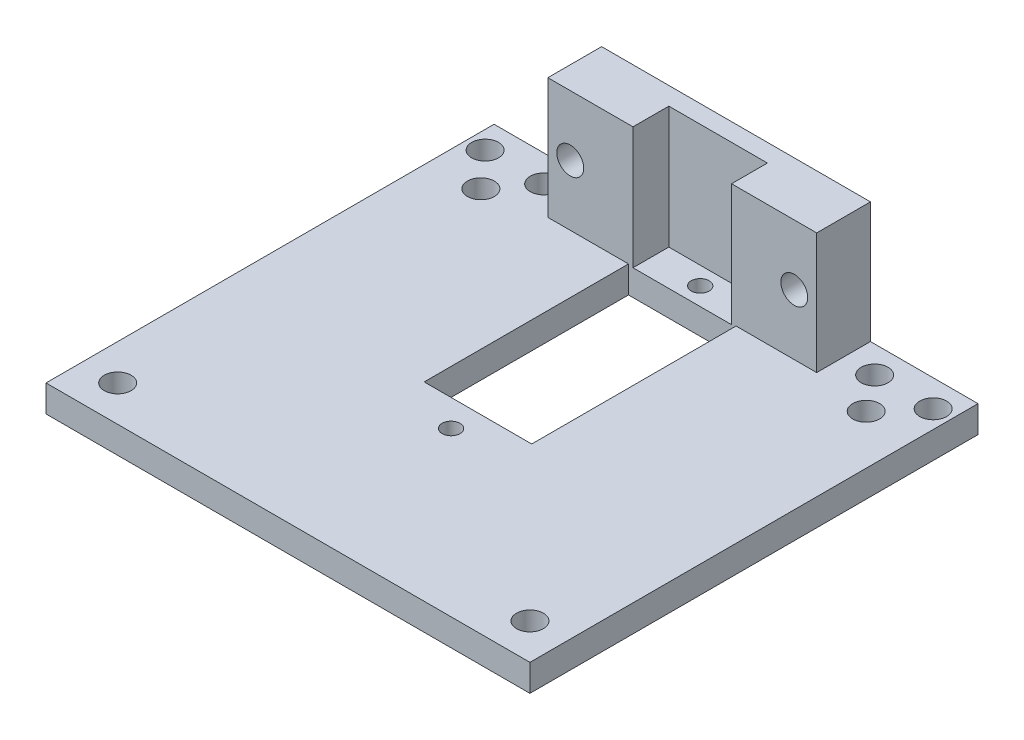
ISO-10303-21;
HEADER;
FILE_DESCRIPTION(('STEP AP214'),'2;1');
FILE_NAME('part.step','',(''),(''),'','','');
FILE_SCHEMA(('AUTOMOTIVE_DESIGN { 1 0 10303 214 1 1 1 1 }'));
ENDSEC;
DATA;
#1=APPLICATION_CONTEXT('core data for automotive mechanical design processes');
#2=APPLICATION_PROTOCOL_DEFINITION('international standard','automotive_design',2000,#1);
#3=PRODUCT_CONTEXT('',#1,'mechanical');
#4=PRODUCT('Part','Part','',(#3));
#5=PRODUCT_RELATED_PRODUCT_CATEGORY('part','',(#4));
#6=PRODUCT_DEFINITION_FORMATION('','',#4);
#7=PRODUCT_DEFINITION_CONTEXT('part definition',#1,'design');
#8=PRODUCT_DEFINITION('design','',#6,#7);
#9=PRODUCT_DEFINITION_SHAPE('','',#8);
#10=(LENGTH_UNIT() NAMED_UNIT(*) SI_UNIT(.MILLI.,.METRE.));
#11=(NAMED_UNIT(*) PLANE_ANGLE_UNIT() SI_UNIT($,.RADIAN.));
#12=(NAMED_UNIT(*) SI_UNIT($,.STERADIAN.) SOLID_ANGLE_UNIT());
#13=UNCERTAINTY_MEASURE_WITH_UNIT(LENGTH_MEASURE(1.E-05),#10,'distance_accuracy_value','');
#14=(GEOMETRIC_REPRESENTATION_CONTEXT(3) GLOBAL_UNCERTAINTY_ASSIGNED_CONTEXT((#13)) GLOBAL_UNIT_ASSIGNED_CONTEXT((#10,
#11,#12)) REPRESENTATION_CONTEXT('',''));
#15=CARTESIAN_POINT('',(0.,0.,0.));
#16=DIRECTION('',(0.,0.,1.));
#17=DIRECTION('',(1.,0.,0.));
#18=AXIS2_PLACEMENT_3D('',#15,#16,#17);
#19=CARTESIAN_POINT('',(0.,0.,0.));
#20=DIRECTION('',(0.,0.,-1.));
#21=DIRECTION('',(-1.,0.,0.));
#22=AXIS2_PLACEMENT_3D('',#19,#20,#21);
#23=PLANE('',#22);
#24=CARTESIAN_POINT('',(10.5,26.75,0.));
#25=DIRECTION('',(0.,0.,1.));
#26=DIRECTION('',(1.,0.,0.));
#27=AXIS2_PLACEMENT_3D('',#24,#25,#26);
#28=CIRCLE('',#27,1.5);
#29=CARTESIAN_POINT('',(12.,26.75,0.));
#30=VERTEX_POINT('',#29);
#31=EDGE_CURVE('E337',#30,#30,#28,.T.);
#32=ORIENTED_EDGE('',*,*,#31,.T.);
#33=EDGE_LOOP('',(#32));
#34=FACE_BOUND('',#33,.T.);
#35=CARTESIAN_POINT('',(35.5,26.75,0.));
#36=DIRECTION('',(0.,0.,1.));
#37=DIRECTION('',(-1.,0.,0.));
#38=AXIS2_PLACEMENT_3D('',#35,#36,#37);
#39=CIRCLE('',#38,1.49999999999999);
#40=CARTESIAN_POINT('',(34.,26.75,0.));
#41=VERTEX_POINT('',#40);
#42=EDGE_CURVE('E333',#41,#41,#39,.T.);
#43=ORIENTED_EDGE('',*,*,#42,.T.);
#44=EDGE_LOOP('',(#43));
#45=FACE_BOUND('',#44,.T.);
#46=DIRECTION('',(0.,1.,0.));
#47=VECTOR('',#46,1.);
#48=CARTESIAN_POINT('',(50.,20.,0.));
#49=LINE('',#48,#47);
#50=CARTESIAN_POINT('',(50.,17.,0.));
#51=VERTEX_POINT('',#50);
#52=CARTESIAN_POINT('',(50.,20.,0.));
#53=VERTEX_POINT('',#52);
#54=EDGE_CURVE('E164',#51,#53,#49,.T.);
#55=ORIENTED_EDGE('',*,*,#54,.F.);
#56=DIRECTION('',(1.,0.,0.));
#57=VECTOR('',#56,1.);
#58=CARTESIAN_POINT('',(46.,17.,0.));
#59=LINE('',#58,#57);
#60=CARTESIAN_POINT('',(-4.,17.,0.));
#61=VERTEX_POINT('',#60);
#62=EDGE_CURVE('E60',#61,#51,#59,.T.);
#63=ORIENTED_EDGE('',*,*,#62,.F.);
#64=DIRECTION('',(0.,-1.,0.));
#65=VECTOR('',#64,1.);
#66=CARTESIAN_POINT('',(-4.,0.,0.));
#67=LINE('',#66,#65);
#68=CARTESIAN_POINT('',(-4.00000000000001,20.,0.));
#69=VERTEX_POINT('',#68);
#70=EDGE_CURVE('E162',#69,#61,#67,.T.);
#71=ORIENTED_EDGE('',*,*,#70,.F.);
#72=DIRECTION('',(-1.,0.,0.));
#73=VECTOR('',#72,1.);
#74=CARTESIAN_POINT('',(-4.00000000000001,20.,0.));
#75=LINE('',#74,#73);
#76=CARTESIAN_POINT('',(8.,20.,0.));
#77=VERTEX_POINT('',#76);
#78=EDGE_CURVE('E182',#77,#69,#75,.T.);
#79=ORIENTED_EDGE('',*,*,#78,.F.);
#80=DIRECTION('',(0.,-1.,0.));
#81=VECTOR('',#80,1.);
#82=CARTESIAN_POINT('',(8.,20.,0.));
#83=LINE('',#82,#81);
#84=CARTESIAN_POINT('',(8.,33.5,0.));
#85=VERTEX_POINT('',#84);
#86=EDGE_CURVE('E186',#85,#77,#83,.T.);
#87=ORIENTED_EDGE('',*,*,#86,.F.);
#88=DIRECTION('',(-1.,0.,0.));
#89=VECTOR('',#88,1.);
#90=CARTESIAN_POINT('',(8.,33.5,0.));
#91=LINE('',#90,#89);
#92=CARTESIAN_POINT('',(38.,33.5,0.));
#93=VERTEX_POINT('',#92);
#94=EDGE_CURVE('E354',#93,#85,#91,.T.);
#95=ORIENTED_EDGE('',*,*,#94,.F.);
#96=DIRECTION('',(0.,1.,0.));
#97=VECTOR('',#96,1.);
#98=CARTESIAN_POINT('',(38.,33.5,0.));
#99=LINE('',#98,#97);
#100=CARTESIAN_POINT('',(38.,20.,0.));
#101=VERTEX_POINT('',#100);
#102=EDGE_CURVE('E352',#101,#93,#99,.T.);
#103=ORIENTED_EDGE('',*,*,#102,.F.);
#104=DIRECTION('',(-1.,0.,0.));
#105=VECTOR('',#104,1.);
#106=CARTESIAN_POINT('',(38.,20.,0.));
#107=LINE('',#106,#105);
#108=EDGE_CURVE('E350',#53,#101,#107,.T.);
#109=ORIENTED_EDGE('',*,*,#108,.F.);
#110=EDGE_LOOP('',(#55,#63,#71,#79,#87,#95,#103,#109));
#111=FACE_BOUND('',#110,.T.);
#112=ADVANCED_FACE('F43',(#34,#45,#111),#23,.T.);
#113=CARTESIAN_POINT('',(50.,20.,6.));
#114=DIRECTION('',(-1.,0.,0.));
#115=DIRECTION('',(0.,-1.,0.));
#116=AXIS2_PLACEMENT_3D('',#113,#114,#115);
#117=PLANE('',#116);
#118=DIRECTION('',(0.,0.,-1.));
#119=VECTOR('',#118,1.);
#120=CARTESIAN_POINT('',(50.,17.,50.));
#121=LINE('',#120,#119);
#122=CARTESIAN_POINT('',(50.,17.,50.));
#123=VERTEX_POINT('',#122);
#124=EDGE_CURVE('E175',#123,#51,#121,.T.);
#125=ORIENTED_EDGE('',*,*,#124,.T.);
#126=ORIENTED_EDGE('',*,*,#54,.T.);
#127=DIRECTION('',(0.,0.,-1.));
#128=VECTOR('',#127,1.);
#129=CARTESIAN_POINT('',(50.,20.,6.));
#130=LINE('',#129,#128);
#131=CARTESIAN_POINT('',(50.,20.,50.));
#132=VERTEX_POINT('',#131);
#133=EDGE_CURVE('E12',#132,#53,#130,.T.);
#134=ORIENTED_EDGE('',*,*,#133,.F.);
#135=DIRECTION('',(0.,1.,0.));
#136=VECTOR('',#135,1.);
#137=CARTESIAN_POINT('',(50.,20.,50.));
#138=LINE('',#137,#136);
#139=EDGE_CURVE('E321',#123,#132,#138,.T.);
#140=ORIENTED_EDGE('',*,*,#139,.F.);
#141=EDGE_LOOP('',(#125,#126,#134,#140));
#142=FACE_BOUND('',#141,.T.);
#143=ADVANCED_FACE('F385',(#142),#117,.F.);
#144=CARTESIAN_POINT('',(-4.,0.,6.));
#145=DIRECTION('',(1.,0.,0.));
#146=DIRECTION('',(0.,1.,0.));
#147=AXIS2_PLACEMENT_3D('',#144,#145,#146);
#148=PLANE('',#147);
#149=ORIENTED_EDGE('',*,*,#70,.T.);
#150=DIRECTION('',(0.,0.,-1.));
#151=VECTOR('',#150,1.);
#152=CARTESIAN_POINT('',(-4.,17.,50.));
#153=LINE('',#152,#151);
#154=CARTESIAN_POINT('',(-4.,17.,50.));
#155=VERTEX_POINT('',#154);
#156=EDGE_CURVE('E169',#155,#61,#153,.T.);
#157=ORIENTED_EDGE('',*,*,#156,.F.);
#158=DIRECTION('',(0.,-1.,0.));
#159=VECTOR('',#158,1.);
#160=CARTESIAN_POINT('',(-4.,17.,50.));
#161=LINE('',#160,#159);
#162=CARTESIAN_POINT('',(-4.00000000000001,20.,50.));
#163=VERTEX_POINT('',#162);
#164=EDGE_CURVE('E176',#163,#155,#161,.T.);
#165=ORIENTED_EDGE('',*,*,#164,.F.);
#166=DIRECTION('',(0.,0.,-1.));
#167=VECTOR('',#166,1.);
#168=CARTESIAN_POINT('',(-4.00000000000001,20.,6.));
#169=LINE('',#168,#167);
#170=EDGE_CURVE('E180',#163,#69,#169,.T.);
#171=ORIENTED_EDGE('',*,*,#170,.T.);
#172=EDGE_LOOP('',(#149,#157,#165,#171));
#173=FACE_BOUND('',#172,.T.);
#174=ADVANCED_FACE('F179',(#173),#148,.F.);
#175=CARTESIAN_POINT('',(0.,0.,6.));
#176=DIRECTION('',(0.,0.,-1.));
#177=DIRECTION('',(-1.,0.,0.));
#178=AXIS2_PLACEMENT_3D('',#175,#176,#177);
#179=PLANE('',#178);
#180=CARTESIAN_POINT('',(35.5,26.75,6.));
#181=DIRECTION('',(0.,0.,1.));
#182=DIRECTION('',(-1.,0.,0.));
#183=AXIS2_PLACEMENT_3D('',#180,#181,#182);
#184=CIRCLE('',#183,1.49999999999999);
#185=CARTESIAN_POINT('',(34.,26.75,6.));
#186=VERTEX_POINT('',#185);
#187=EDGE_CURVE('E334',#186,#186,#184,.T.);
#188=ORIENTED_EDGE('',*,*,#187,.F.);
#189=EDGE_LOOP('',(#188));
#190=FACE_BOUND('',#189,.T.);
#191=CARTESIAN_POINT('',(10.5,26.75,6.));
#192=DIRECTION('',(0.,0.,1.));
#193=DIRECTION('',(1.,0.,0.));
#194=AXIS2_PLACEMENT_3D('',#191,#192,#193);
#195=CIRCLE('',#194,1.5);
#196=CARTESIAN_POINT('',(12.,26.75,6.));
#197=VERTEX_POINT('',#196);
#198=EDGE_CURVE('E165',#197,#197,#195,.T.);
#199=ORIENTED_EDGE('',*,*,#198,.F.);
#200=EDGE_LOOP('',(#199));
#201=FACE_BOUND('',#200,.T.);
#202=DIRECTION('',(1.,0.,0.));
#203=VECTOR('',#202,1.);
#204=CARTESIAN_POINT('',(17.5,19.88,6.));
#205=LINE('',#204,#203);
#206=CARTESIAN_POINT('',(17.5,19.88,6.));
#207=VERTEX_POINT('',#206);
#208=CARTESIAN_POINT('',(28.5,19.88,6.));
#209=VERTEX_POINT('',#208);
#210=EDGE_CURVE('E235',#207,#209,#205,.T.);
#211=ORIENTED_EDGE('',*,*,#210,.F.);
#212=DIRECTION('',(0.,1.,0.));
#213=VECTOR('',#212,1.);
#214=CARTESIAN_POINT('',(17.5,19.88,6.));
#215=LINE('',#214,#213);
#216=CARTESIAN_POINT('',(17.5,33.5,6.));
#217=VERTEX_POINT('',#216);
#218=EDGE_CURVE('E253',#207,#217,#215,.T.);
#219=ORIENTED_EDGE('',*,*,#218,.T.);
#220=DIRECTION('',(-1.,0.,0.));
#221=VECTOR('',#220,1.);
#222=CARTESIAN_POINT('',(8.,33.5,6.));
#223=LINE('',#222,#221);
#224=CARTESIAN_POINT('',(8.,33.5,6.));
#225=VERTEX_POINT('',#224);
#226=EDGE_CURVE('E184',#217,#225,#223,.T.);
#227=ORIENTED_EDGE('',*,*,#226,.T.);
#228=DIRECTION('',(0.,-1.,0.));
#229=VECTOR('',#228,1.);
#230=CARTESIAN_POINT('',(8.,20.,6.));
#231=LINE('',#230,#229);
#232=CARTESIAN_POINT('',(8.,20.,6.));
#233=VERTEX_POINT('',#232);
#234=EDGE_CURVE('E192',#225,#233,#231,.T.);
#235=ORIENTED_EDGE('',*,*,#234,.T.);
#236=DIRECTION('',(-1.,0.,0.));
#237=VECTOR('',#236,1.);
#238=CARTESIAN_POINT('',(0.,20.,6.));
#239=LINE('',#238,#237);
#240=CARTESIAN_POINT('',(17.,20.,6.));
#241=VERTEX_POINT('',#240);
#242=EDGE_CURVE('E329',#241,#233,#239,.T.);
#243=ORIENTED_EDGE('',*,*,#242,.F.);
#244=DIRECTION('',(0.,1.,0.));
#245=VECTOR('',#244,1.);
#246=CARTESIAN_POINT('',(17.,-3.99999999999998,5.99999999999999));
#247=LINE('',#246,#245);
#248=CARTESIAN_POINT('',(17.,17.,5.99999999999999));
#249=VERTEX_POINT('',#248);
#250=EDGE_CURVE('E276',#249,#241,#247,.T.);
#251=ORIENTED_EDGE('',*,*,#250,.F.);
#252=DIRECTION('',(-1.,0.,0.));
#253=VECTOR('',#252,1.);
#254=CARTESIAN_POINT('',(46.,17.,6.));
#255=LINE('',#254,#253);
#256=CARTESIAN_POINT('',(29.,17.,5.99999999999999));
#257=VERTEX_POINT('',#256);
#258=EDGE_CURVE('E305',#257,#249,#255,.T.);
#259=ORIENTED_EDGE('',*,*,#258,.F.);
#260=DIRECTION('',(0.,1.,0.));
#261=VECTOR('',#260,1.);
#262=CARTESIAN_POINT('',(29.,-3.99999999999998,5.99999999999999));
#263=LINE('',#262,#261);
#264=CARTESIAN_POINT('',(29.,20.,5.99999999999999));
#265=VERTEX_POINT('',#264);
#266=EDGE_CURVE('E266',#257,#265,#263,.T.);
#267=ORIENTED_EDGE('',*,*,#266,.T.);
#268=CARTESIAN_POINT('',(38.,20.,6.));
#269=VERTEX_POINT('',#268);
#270=EDGE_CURVE('E330',#269,#265,#239,.T.);
#271=ORIENTED_EDGE('',*,*,#270,.F.);
#272=DIRECTION('',(0.,1.,0.));
#273=VECTOR('',#272,1.);
#274=CARTESIAN_POINT('',(38.,33.5,6.));
#275=LINE('',#274,#273);
#276=CARTESIAN_POINT('',(38.,33.5,6.));
#277=VERTEX_POINT('',#276);
#278=EDGE_CURVE('E181',#269,#277,#275,.T.);
#279=ORIENTED_EDGE('',*,*,#278,.T.);
#280=CARTESIAN_POINT('',(28.5,33.5,6.));
#281=VERTEX_POINT('',#280);
#282=EDGE_CURVE('E344',#277,#281,#223,.T.);
#283=ORIENTED_EDGE('',*,*,#282,.T.);
#284=DIRECTION('',(0.,1.,0.));
#285=VECTOR('',#284,1.);
#286=CARTESIAN_POINT('',(28.5,19.88,6.));
#287=LINE('',#286,#285);
#288=EDGE_CURVE('E68',#209,#281,#287,.T.);
#289=ORIENTED_EDGE('',*,*,#288,.F.);
#290=EDGE_LOOP('',(#211,#219,#227,#235,#243,#251,#259,#267,#271,#279,#283,#289));
#291=FACE_BOUND('',#290,.T.);
#292=ADVANCED_FACE('F370',(#190,#201,#291),#179,.F.);
#293=CARTESIAN_POINT('',(46.,17.,6.));
#294=DIRECTION('',(0.,1.,0.));
#295=DIRECTION('',(-1.,0.,0.));
#296=AXIS2_PLACEMENT_3D('',#293,#294,#295);
#297=PLANE('',#296);
#298=ORIENTED_EDGE('',*,*,#62,.T.);
#299=ORIENTED_EDGE('',*,*,#124,.F.);
#300=DIRECTION('',(1.,0.,0.));
#301=VECTOR('',#300,1.);
#302=CARTESIAN_POINT('',(50.,17.,50.));
#303=LINE('',#302,#301);
#304=EDGE_CURVE('E172',#155,#123,#303,.T.);
#305=ORIENTED_EDGE('',*,*,#304,.F.);
#306=ORIENTED_EDGE('',*,*,#156,.T.);
#307=EDGE_LOOP('',(#298,#299,#305,#306));
#308=FACE_BOUND('',#307,.T.);
#309=CARTESIAN_POINT('',(0.,17.,46.));
#310=DIRECTION('',(0.,1.,0.));
#311=DIRECTION('',(-1.,0.,0.));
#312=AXIS2_PLACEMENT_3D('',#309,#310,#311);
#313=CIRCLE('',#312,1.5);
#314=CARTESIAN_POINT('',(0.,17.,47.5));
#315=VERTEX_POINT('',#314);
#316=EDGE_CURVE('E225',#315,#315,#313,.T.);
#317=ORIENTED_EDGE('',*,*,#316,.T.);
#318=EDGE_LOOP('',(#317));
#319=FACE_BOUND('',#318,.T.);
#320=CARTESIAN_POINT('',(46.,17.,46.));
#321=DIRECTION('',(0.,1.,0.));
#322=DIRECTION('',(-1.,0.,0.));
#323=AXIS2_PLACEMENT_3D('',#320,#321,#322);
#324=CIRCLE('',#323,1.5);
#325=CARTESIAN_POINT('',(46.,17.,47.5));
#326=VERTEX_POINT('',#325);
#327=EDGE_CURVE('E220',#326,#326,#324,.T.);
#328=ORIENTED_EDGE('',*,*,#327,.T.);
#329=EDGE_LOOP('',(#328));
#330=FACE_BOUND('',#329,.T.);
#331=CARTESIAN_POINT('',(23.,17.,4.));
#332=DIRECTION('',(0.,1.,0.));
#333=DIRECTION('',(-1.,0.,0.));
#334=AXIS2_PLACEMENT_3D('',#331,#332,#333);
#335=CIRCLE('',#334,1.);
#336=CARTESIAN_POINT('',(22.,17.,4.));
#337=VERTEX_POINT('',#336);
#338=EDGE_CURVE('E231',#337,#337,#335,.T.);
#339=ORIENTED_EDGE('',*,*,#338,.T.);
#340=EDGE_LOOP('',(#339));
#341=FACE_BOUND('',#340,.T.);
#342=CARTESIAN_POINT('',(23.,17.,31.8));
#343=DIRECTION('',(0.,1.,0.));
#344=DIRECTION('',(-1.,0.,0.));
#345=AXIS2_PLACEMENT_3D('',#342,#343,#344);
#346=CIRCLE('',#345,1.);
#347=CARTESIAN_POINT('',(22.,17.,31.8));
#348=VERTEX_POINT('',#347);
#349=EDGE_CURVE('E317',#348,#348,#346,.T.);
#350=ORIENTED_EDGE('',*,*,#349,.T.);
#351=EDGE_LOOP('',(#350));
#352=FACE_BOUND('',#351,.T.);
#353=CARTESIAN_POINT('',(1.49999999999999,17.,6.97423575837485));
#354=DIRECTION('',(0.,1.,0.));
#355=DIRECTION('',(-1.,0.,0.));
#356=AXIS2_PLACEMENT_3D('',#353,#354,#355);
#357=CIRCLE('',#356,1.5);
#358=CARTESIAN_POINT('',(0.,17.,6.97423575837485));
#359=VERTEX_POINT('',#358);
#360=EDGE_CURVE('E314',#359,#359,#357,.T.);
#361=ORIENTED_EDGE('',*,*,#360,.T.);
#362=EDGE_LOOP('',(#361));
#363=FACE_BOUND('',#362,.T.);
#364=CARTESIAN_POINT('',(41.4659515269438,17.,3.));
#365=DIRECTION('',(0.,1.,0.));
#366=DIRECTION('',(-1.,0.,0.));
#367=AXIS2_PLACEMENT_3D('',#364,#365,#366);
#368=CIRCLE('',#367,1.5);
#369=CARTESIAN_POINT('',(39.9659515269438,17.,3.));
#370=VERTEX_POINT('',#369);
#371=EDGE_CURVE('E311',#370,#370,#368,.T.);
#372=ORIENTED_EDGE('',*,*,#371,.T.);
#373=EDGE_LOOP('',(#372));
#374=FACE_BOUND('',#373,.T.);
#375=CARTESIAN_POINT('',(44.5,17.,6.97423575837485));
#376=DIRECTION('',(0.,1.,0.));
#377=DIRECTION('',(-1.,0.,0.));
#378=AXIS2_PLACEMENT_3D('',#375,#376,#377);
#379=CIRCLE('',#378,1.5);
#380=CARTESIAN_POINT('',(43.,17.,6.97423575837485));
#381=VERTEX_POINT('',#380);
#382=EDGE_CURVE('E308',#381,#381,#379,.T.);
#383=ORIENTED_EDGE('',*,*,#382,.T.);
#384=EDGE_LOOP('',(#383));
#385=FACE_BOUND('',#384,.T.);
#386=DIRECTION('',(0.,0.,-1.));
#387=VECTOR('',#386,1.);
#388=CARTESIAN_POINT('',(29.,17.,5.99999999999999));
#389=LINE('',#388,#387);
#390=CARTESIAN_POINT('',(29.,17.,28.8));
#391=VERTEX_POINT('',#390);
#392=EDGE_CURVE('E302',#391,#257,#389,.T.);
#393=ORIENTED_EDGE('',*,*,#392,.T.);
#394=ORIENTED_EDGE('',*,*,#258,.T.);
#395=DIRECTION('',(0.,0.,1.));
#396=VECTOR('',#395,1.);
#397=CARTESIAN_POINT('',(17.,17.,6.));
#398=LINE('',#397,#396);
#399=CARTESIAN_POINT('',(17.,17.,28.8));
#400=VERTEX_POINT('',#399);
#401=EDGE_CURVE('E296',#249,#400,#398,.T.);
#402=ORIENTED_EDGE('',*,*,#401,.T.);
#403=DIRECTION('',(1.,0.,0.));
#404=VECTOR('',#403,1.);
#405=CARTESIAN_POINT('',(46.,17.,28.8));
#406=LINE('',#405,#404);
#407=EDGE_CURVE('E299',#400,#391,#406,.T.);
#408=ORIENTED_EDGE('',*,*,#407,.T.);
#409=EDGE_LOOP('',(#393,#394,#402,#408));
#410=FACE_BOUND('',#409,.T.);
#411=CARTESIAN_POINT('',(4.5340484730562,17.,3.));
#412=DIRECTION('',(0.,1.,0.));
#413=DIRECTION('',(-1.,0.,0.));
#414=AXIS2_PLACEMENT_3D('',#411,#412,#413);
#415=CIRCLE('',#414,1.5);
#416=CARTESIAN_POINT('',(3.0340484730562,17.,3.));
#417=VERTEX_POINT('',#416);
#418=EDGE_CURVE('E293',#417,#417,#415,.T.);
#419=ORIENTED_EDGE('',*,*,#418,.T.);
#420=EDGE_LOOP('',(#419));
#421=FACE_BOUND('',#420,.T.);
#422=CARTESIAN_POINT('',(48.,17.,3.));
#423=DIRECTION('',(0.,-1.,0.));
#424=DIRECTION('',(1.,0.,0.));
#425=AXIS2_PLACEMENT_3D('',#422,#423,#424);
#426=CIRCLE('',#425,1.5);
#427=CARTESIAN_POINT('',(49.5,17.,3.));
#428=VERTEX_POINT('',#427);
#429=EDGE_CURVE('E210',#428,#428,#426,.T.);
#430=ORIENTED_EDGE('',*,*,#429,.F.);
#431=EDGE_LOOP('',(#430));
#432=FACE_BOUND('',#431,.T.);
#433=CARTESIAN_POINT('',(-2.,17.,3.));
#434=DIRECTION('',(0.,-1.,0.));
#435=DIRECTION('',(1.,0.,0.));
#436=AXIS2_PLACEMENT_3D('',#433,#434,#435);
#437=CIRCLE('',#436,1.5);
#438=CARTESIAN_POINT('',(-0.500000000000002,17.,3.));
#439=VERTEX_POINT('',#438);
#440=EDGE_CURVE('E204',#439,#439,#437,.T.);
#441=ORIENTED_EDGE('',*,*,#440,.F.);
#442=EDGE_LOOP('',(#441));
#443=FACE_BOUND('',#442,.T.);
#444=ADVANCED_FACE('F45',(#308,#319,#330,#341,#352,#363,#374,#385,#410,#421,#432,#443),#297,.F.);
#445=CARTESIAN_POINT('',(38.,33.5,6.));
#446=DIRECTION('',(-1.,0.,0.));
#447=DIRECTION('',(0.,0.,1.));
#448=AXIS2_PLACEMENT_3D('',#445,#446,#447);
#449=PLANE('',#448);
#450=ORIENTED_EDGE('',*,*,#102,.T.);
#451=DIRECTION('',(0.,0.,-1.));
#452=VECTOR('',#451,1.);
#453=CARTESIAN_POINT('',(38.,33.5,6.));
#454=LINE('',#453,#452);
#455=EDGE_CURVE('E198',#277,#93,#454,.T.);
#456=ORIENTED_EDGE('',*,*,#455,.F.);
#457=ORIENTED_EDGE('',*,*,#278,.F.);
#458=DIRECTION('',(0.,0.,-1.));
#459=VECTOR('',#458,1.);
#460=CARTESIAN_POINT('',(38.,20.,6.));
#461=LINE('',#460,#459);
#462=EDGE_CURVE('E52',#269,#101,#461,.T.);
#463=ORIENTED_EDGE('',*,*,#462,.T.);
#464=EDGE_LOOP('',(#450,#456,#457,#463));
#465=FACE_BOUND('',#464,.T.);
#466=ADVANCED_FACE('F379',(#465),#449,.F.);
#467=CARTESIAN_POINT('',(8.,33.5,6.));
#468=DIRECTION('',(0.,-1.,0.));
#469=DIRECTION('',(1.,0.,0.));
#470=AXIS2_PLACEMENT_3D('',#467,#468,#469);
#471=PLANE('',#470);
#472=ORIENTED_EDGE('',*,*,#226,.F.);
#473=DIRECTION('',(0.,0.,1.));
#474=VECTOR('',#473,1.);
#475=CARTESIAN_POINT('',(17.5,33.5,2.));
#476=LINE('',#475,#474);
#477=CARTESIAN_POINT('',(17.5,33.5,2.));
#478=VERTEX_POINT('',#477);
#479=EDGE_CURVE('E239',#478,#217,#476,.T.);
#480=ORIENTED_EDGE('',*,*,#479,.F.);
#481=DIRECTION('',(-1.,0.,0.));
#482=VECTOR('',#481,1.);
#483=CARTESIAN_POINT('',(28.5,33.5,2.));
#484=LINE('',#483,#482);
#485=CARTESIAN_POINT('',(28.5,33.5,2.));
#486=VERTEX_POINT('',#485);
#487=EDGE_CURVE('E249',#486,#478,#484,.T.);
#488=ORIENTED_EDGE('',*,*,#487,.F.);
#489=DIRECTION('',(0.,0.,-1.));
#490=VECTOR('',#489,1.);
#491=CARTESIAN_POINT('',(28.5,33.5,6.));
#492=LINE('',#491,#490);
#493=EDGE_CURVE('E234',#281,#486,#492,.T.);
#494=ORIENTED_EDGE('',*,*,#493,.F.);
#495=ORIENTED_EDGE('',*,*,#282,.F.);
#496=ORIENTED_EDGE('',*,*,#455,.T.);
#497=ORIENTED_EDGE('',*,*,#94,.T.);
#498=DIRECTION('',(0.,0.,-1.));
#499=VECTOR('',#498,1.);
#500=CARTESIAN_POINT('',(8.,33.5,6.));
#501=LINE('',#500,#499);
#502=EDGE_CURVE('E195',#225,#85,#501,.T.);
#503=ORIENTED_EDGE('',*,*,#502,.F.);
#504=EDGE_LOOP('',(#472,#480,#488,#494,#495,#496,#497,#503));
#505=FACE_BOUND('',#504,.T.);
#506=ADVANCED_FACE('F374',(#505),#471,.F.);
#507=CARTESIAN_POINT('',(8.,20.,6.));
#508=DIRECTION('',(1.,0.,0.));
#509=DIRECTION('',(0.,1.,0.));
#510=AXIS2_PLACEMENT_3D('',#507,#508,#509);
#511=PLANE('',#510);
#512=ORIENTED_EDGE('',*,*,#86,.T.);
#513=DIRECTION('',(0.,0.,-1.));
#514=VECTOR('',#513,1.);
#515=CARTESIAN_POINT('',(8.,20.,6.));
#516=LINE('',#515,#514);
#517=EDGE_CURVE('E191',#233,#77,#516,.T.);
#518=ORIENTED_EDGE('',*,*,#517,.F.);
#519=ORIENTED_EDGE('',*,*,#234,.F.);
#520=ORIENTED_EDGE('',*,*,#502,.T.);
#521=EDGE_LOOP('',(#512,#518,#519,#520));
#522=FACE_BOUND('',#521,.T.);
#523=ADVANCED_FACE('F358',(#522),#511,.F.);
#524=CARTESIAN_POINT('',(-4.00000000000001,20.,6.));
#525=DIRECTION('',(0.,-1.,0.));
#526=DIRECTION('',(0.,0.,-1.));
#527=AXIS2_PLACEMENT_3D('',#524,#525,#526);
#528=PLANE('',#527);
#529=CARTESIAN_POINT('',(48.,20.,3.));
#530=DIRECTION('',(0.,-1.,0.));
#531=DIRECTION('',(0.,0.,-1.));
#532=AXIS2_PLACEMENT_3D('',#529,#530,#531);
#533=CIRCLE('',#532,1.5);
#534=CARTESIAN_POINT('',(48.,20.,1.5));
#535=VERTEX_POINT('',#534);
#536=EDGE_CURVE('E47',#535,#535,#533,.T.);
#537=ORIENTED_EDGE('',*,*,#536,.T.);
#538=EDGE_LOOP('',(#537));
#539=FACE_BOUND('',#538,.T.);
#540=CARTESIAN_POINT('',(-2.,20.,3.));
#541=DIRECTION('',(0.,-1.,0.));
#542=DIRECTION('',(0.,0.,-1.));
#543=AXIS2_PLACEMENT_3D('',#540,#541,#542);
#544=CIRCLE('',#543,1.5);
#545=CARTESIAN_POINT('',(-2.,20.,1.5));
#546=VERTEX_POINT('',#545);
#547=EDGE_CURVE('E202',#546,#546,#544,.T.);
#548=ORIENTED_EDGE('',*,*,#547,.T.);
#549=EDGE_LOOP('',(#548));
#550=FACE_BOUND('',#549,.T.);
#551=CARTESIAN_POINT('',(0.,20.,46.));
#552=DIRECTION('',(0.,1.,0.));
#553=DIRECTION('',(0.,0.,1.));
#554=AXIS2_PLACEMENT_3D('',#551,#552,#553);
#555=CIRCLE('',#554,1.5);
#556=CARTESIAN_POINT('',(0.,20.,47.5));
#557=VERTEX_POINT('',#556);
#558=EDGE_CURVE('E217',#557,#557,#555,.T.);
#559=ORIENTED_EDGE('',*,*,#558,.F.);
#560=EDGE_LOOP('',(#559));
#561=FACE_BOUND('',#560,.T.);
#562=CARTESIAN_POINT('',(46.,20.,46.));
#563=DIRECTION('',(0.,1.,0.));
#564=DIRECTION('',(0.,0.,-1.));
#565=AXIS2_PLACEMENT_3D('',#562,#563,#564);
#566=CIRCLE('',#565,1.5);
#567=CARTESIAN_POINT('',(46.,20.,47.5));
#568=VERTEX_POINT('',#567);
#569=EDGE_CURVE('E208',#568,#568,#566,.T.);
#570=ORIENTED_EDGE('',*,*,#569,.F.);
#571=EDGE_LOOP('',(#570));
#572=FACE_BOUND('',#571,.T.);
#573=CARTESIAN_POINT('',(23.,20.,31.8));
#574=DIRECTION('',(0.,1.,0.));
#575=DIRECTION('',(0.,0.,1.));
#576=AXIS2_PLACEMENT_3D('',#573,#574,#575);
#577=CIRCLE('',#576,1.);
#578=CARTESIAN_POINT('',(23.,20.,32.8));
#579=VERTEX_POINT('',#578);
#580=EDGE_CURVE('E256',#579,#579,#577,.T.);
#581=ORIENTED_EDGE('',*,*,#580,.F.);
#582=EDGE_LOOP('',(#581));
#583=FACE_BOUND('',#582,.T.);
#584=CARTESIAN_POINT('',(1.49999999999999,20.,6.97423575837485));
#585=DIRECTION('',(0.,1.,0.));
#586=DIRECTION('',(0.,0.,1.));
#587=AXIS2_PLACEMENT_3D('',#584,#585,#586);
#588=CIRCLE('',#587,1.5);
#589=CARTESIAN_POINT('',(1.49999999999999,20.,8.47423575837485));
#590=VERTEX_POINT('',#589);
#591=EDGE_CURVE('E283',#590,#590,#588,.T.);
#592=ORIENTED_EDGE('',*,*,#591,.F.);
#593=EDGE_LOOP('',(#592));
#594=FACE_BOUND('',#593,.T.);
#595=CARTESIAN_POINT('',(41.4659515269438,20.,3.));
#596=DIRECTION('',(0.,1.,0.));
#597=DIRECTION('',(0.,0.,-1.));
#598=AXIS2_PLACEMENT_3D('',#595,#596,#597);
#599=CIRCLE('',#598,1.5);
#600=CARTESIAN_POINT('',(41.4659515269438,20.,1.5));
#601=VERTEX_POINT('',#600);
#602=EDGE_CURVE('E265',#601,#601,#599,.T.);
#603=ORIENTED_EDGE('',*,*,#602,.F.);
#604=EDGE_LOOP('',(#603));
#605=FACE_BOUND('',#604,.T.);
#606=CARTESIAN_POINT('',(44.5,20.,6.97423575837485));
#607=DIRECTION('',(0.,1.,0.));
#608=DIRECTION('',(0.,0.,-1.));
#609=AXIS2_PLACEMENT_3D('',#606,#607,#608);
#610=CIRCLE('',#609,1.5);
#611=CARTESIAN_POINT('',(44.5,20.,5.47423575837485));
#612=VERTEX_POINT('',#611);
#613=EDGE_CURVE('E262',#612,#612,#610,.T.);
#614=ORIENTED_EDGE('',*,*,#613,.F.);
#615=EDGE_LOOP('',(#614));
#616=FACE_BOUND('',#615,.T.);
#617=CARTESIAN_POINT('',(4.5340484730562,20.,3.));
#618=DIRECTION('',(0.,1.,0.));
#619=DIRECTION('',(0.,0.,1.));
#620=AXIS2_PLACEMENT_3D('',#617,#618,#619);
#621=CIRCLE('',#620,1.5);
#622=CARTESIAN_POINT('',(4.5340484730562,20.,4.5));
#623=VERTEX_POINT('',#622);
#624=EDGE_CURVE('E286',#623,#623,#621,.T.);
#625=ORIENTED_EDGE('',*,*,#624,.F.);
#626=EDGE_LOOP('',(#625));
#627=FACE_BOUND('',#626,.T.);
#628=ORIENTED_EDGE('',*,*,#270,.T.);
#629=DIRECTION('',(0.,0.,-1.));
#630=VECTOR('',#629,1.);
#631=CARTESIAN_POINT('',(29.,20.,28.8));
#632=LINE('',#631,#630);
#633=CARTESIAN_POINT('',(29.,20.,28.8));
#634=VERTEX_POINT('',#633);
#635=EDGE_CURVE('E273',#634,#265,#632,.T.);
#636=ORIENTED_EDGE('',*,*,#635,.F.);
#637=DIRECTION('',(1.,0.,0.));
#638=VECTOR('',#637,1.);
#639=CARTESIAN_POINT('',(17.,20.,28.8));
#640=LINE('',#639,#638);
#641=CARTESIAN_POINT('',(17.,20.,28.8));
#642=VERTEX_POINT('',#641);
#643=EDGE_CURVE('E270',#642,#634,#640,.T.);
#644=ORIENTED_EDGE('',*,*,#643,.F.);
#645=DIRECTION('',(0.,0.,1.));
#646=VECTOR('',#645,1.);
#647=CARTESIAN_POINT('',(17.,20.,5.99999999999999));
#648=LINE('',#647,#646);
#649=EDGE_CURVE('E267',#241,#642,#648,.T.);
#650=ORIENTED_EDGE('',*,*,#649,.F.);
#651=ORIENTED_EDGE('',*,*,#242,.T.);
#652=ORIENTED_EDGE('',*,*,#517,.T.);
#653=ORIENTED_EDGE('',*,*,#78,.T.);
#654=ORIENTED_EDGE('',*,*,#170,.F.);
#655=DIRECTION('',(-1.,0.,0.));
#656=VECTOR('',#655,1.);
#657=CARTESIAN_POINT('',(-4.00000000000001,20.,50.));
#658=LINE('',#657,#656);
#659=EDGE_CURVE('E324',#132,#163,#658,.T.);
#660=ORIENTED_EDGE('',*,*,#659,.F.);
#661=ORIENTED_EDGE('',*,*,#133,.T.);
#662=ORIENTED_EDGE('',*,*,#108,.T.);
#663=ORIENTED_EDGE('',*,*,#462,.F.);
#664=EDGE_LOOP('',(#628,#636,#644,#650,#651,#652,#653,#654,#660,#661,#662,#663));
#665=FACE_BOUND('',#664,.T.);
#666=ADVANCED_FACE('F363',(#539,#550,#561,#572,#583,#594,#605,#616,#627,#665),#528,.F.);
#667=CARTESIAN_POINT('',(10.5,26.75,6.));
#668=DIRECTION('',(0.,0.,-1.));
#669=DIRECTION('',(-1.,0.,0.));
#670=AXIS2_PLACEMENT_3D('',#667,#668,#669);
#671=CYLINDRICAL_SURFACE('',#670,1.5);
#672=ORIENTED_EDGE('',*,*,#198,.T.);
#673=EDGE_LOOP('',(#672));
#674=FACE_BOUND('',#673,.T.);
#675=ORIENTED_EDGE('',*,*,#31,.F.);
#676=EDGE_LOOP('',(#675));
#677=FACE_BOUND('',#676,.T.);
#678=ADVANCED_FACE('F399',(#674,#677),#671,.F.);
#679=CARTESIAN_POINT('',(35.5,26.75,6.));
#680=DIRECTION('',(0.,0.,-1.));
#681=DIRECTION('',(-1.,0.,0.));
#682=AXIS2_PLACEMENT_3D('',#679,#680,#681);
#683=CYLINDRICAL_SURFACE('',#682,1.49999999999999);
#684=ORIENTED_EDGE('',*,*,#187,.T.);
#685=EDGE_LOOP('',(#684));
#686=FACE_BOUND('',#685,.T.);
#687=ORIENTED_EDGE('',*,*,#42,.F.);
#688=EDGE_LOOP('',(#687));
#689=FACE_BOUND('',#688,.T.);
#690=ADVANCED_FACE('F390',(#686,#689),#683,.F.);
#691=CARTESIAN_POINT('',(0.,0.,50.));
#692=DIRECTION('',(0.,0.,-1.));
#693=DIRECTION('',(-1.,0.,0.));
#694=AXIS2_PLACEMENT_3D('',#691,#692,#693);
#695=PLANE('',#694);
#696=ORIENTED_EDGE('',*,*,#304,.T.);
#697=ORIENTED_EDGE('',*,*,#139,.T.);
#698=ORIENTED_EDGE('',*,*,#659,.T.);
#699=ORIENTED_EDGE('',*,*,#164,.T.);
#700=EDGE_LOOP('',(#696,#697,#698,#699));
#701=FACE_BOUND('',#700,.T.);
#702=ADVANCED_FACE('F387',(#701),#695,.F.);
#703=CARTESIAN_POINT('',(4.5340484730562,-3.99999999999998,3.));
#704=DIRECTION('',(0.,1.,0.));
#705=DIRECTION('',(0.,0.,1.));
#706=AXIS2_PLACEMENT_3D('',#703,#704,#705);
#707=CYLINDRICAL_SURFACE('',#706,1.5);
#708=ORIENTED_EDGE('',*,*,#624,.T.);
#709=EDGE_LOOP('',(#708));
#710=FACE_BOUND('',#709,.T.);
#711=ORIENTED_EDGE('',*,*,#418,.F.);
#712=EDGE_LOOP('',(#711));
#713=FACE_BOUND('',#712,.T.);
#714=ADVANCED_FACE('F389',(#710,#713),#707,.F.);
#715=CARTESIAN_POINT('',(29.,-3.99999999999998,28.8));
#716=DIRECTION('',(1.,0.,0.));
#717=DIRECTION('',(0.,0.,-1.));
#718=AXIS2_PLACEMENT_3D('',#715,#716,#717);
#719=PLANE('',#718);
#720=DIRECTION('',(0.,1.,0.));
#721=VECTOR('',#720,1.);
#722=CARTESIAN_POINT('',(29.,-3.99999999999998,28.8));
#723=LINE('',#722,#721);
#724=EDGE_CURVE('E278',#391,#634,#723,.T.);
#725=ORIENTED_EDGE('',*,*,#724,.T.);
#726=ORIENTED_EDGE('',*,*,#635,.T.);
#727=ORIENTED_EDGE('',*,*,#266,.F.);
#728=ORIENTED_EDGE('',*,*,#392,.F.);
#729=EDGE_LOOP('',(#725,#726,#727,#728));
#730=FACE_BOUND('',#729,.T.);
#731=ADVANCED_FACE('F396',(#730),#719,.F.);
#732=CARTESIAN_POINT('',(17.,-3.99999999999998,28.8));
#733=DIRECTION('',(0.,0.,1.));
#734=DIRECTION('',(1.,0.,0.));
#735=AXIS2_PLACEMENT_3D('',#732,#733,#734);
#736=PLANE('',#735);
#737=DIRECTION('',(0.,1.,0.));
#738=VECTOR('',#737,1.);
#739=CARTESIAN_POINT('',(17.,-3.99999999999998,28.8));
#740=LINE('',#739,#738);
#741=EDGE_CURVE('E280',#400,#642,#740,.T.);
#742=ORIENTED_EDGE('',*,*,#741,.T.);
#743=ORIENTED_EDGE('',*,*,#643,.T.);
#744=ORIENTED_EDGE('',*,*,#724,.F.);
#745=ORIENTED_EDGE('',*,*,#407,.F.);
#746=EDGE_LOOP('',(#742,#743,#744,#745));
#747=FACE_BOUND('',#746,.T.);
#748=ADVANCED_FACE('F488',(#747),#736,.F.);
#749=CARTESIAN_POINT('',(17.,-3.99999999999998,5.99999999999999));
#750=DIRECTION('',(-1.,0.,0.));
#751=DIRECTION('',(0.,0.,1.));
#752=AXIS2_PLACEMENT_3D('',#749,#750,#751);
#753=PLANE('',#752);
#754=ORIENTED_EDGE('',*,*,#250,.T.);
#755=ORIENTED_EDGE('',*,*,#649,.T.);
#756=ORIENTED_EDGE('',*,*,#741,.F.);
#757=ORIENTED_EDGE('',*,*,#401,.F.);
#758=EDGE_LOOP('',(#754,#755,#756,#757));
#759=FACE_BOUND('',#758,.T.);
#760=ADVANCED_FACE('F499',(#759),#753,.F.);
#761=CARTESIAN_POINT('',(44.5,-3.99999999999998,6.97423575837485));
#762=DIRECTION('',(0.,1.,0.));
#763=DIRECTION('',(0.,0.,1.));
#764=AXIS2_PLACEMENT_3D('',#761,#762,#763);
#765=CYLINDRICAL_SURFACE('',#764,1.5);
#766=ORIENTED_EDGE('',*,*,#613,.T.);
#767=EDGE_LOOP('',(#766));
#768=FACE_BOUND('',#767,.T.);
#769=ORIENTED_EDGE('',*,*,#382,.F.);
#770=EDGE_LOOP('',(#769));
#771=FACE_BOUND('',#770,.T.);
#772=ADVANCED_FACE('F510',(#768,#771),#765,.F.);
#773=CARTESIAN_POINT('',(41.4659515269438,-3.99999999999998,3.));
#774=DIRECTION('',(0.,1.,0.));
#775=DIRECTION('',(0.,0.,1.));
#776=AXIS2_PLACEMENT_3D('',#773,#774,#775);
#777=CYLINDRICAL_SURFACE('',#776,1.5);
#778=ORIENTED_EDGE('',*,*,#602,.T.);
#779=EDGE_LOOP('',(#778));
#780=FACE_BOUND('',#779,.T.);
#781=ORIENTED_EDGE('',*,*,#371,.F.);
#782=EDGE_LOOP('',(#781));
#783=FACE_BOUND('',#782,.T.);
#784=ADVANCED_FACE('F521',(#780,#783),#777,.F.);
#785=CARTESIAN_POINT('',(1.49999999999999,-3.99999999999998,6.97423575837485));
#786=DIRECTION('',(0.,1.,0.));
#787=DIRECTION('',(0.,0.,1.));
#788=AXIS2_PLACEMENT_3D('',#785,#786,#787);
#789=CYLINDRICAL_SURFACE('',#788,1.5);
#790=ORIENTED_EDGE('',*,*,#591,.T.);
#791=EDGE_LOOP('',(#790));
#792=FACE_BOUND('',#791,.T.);
#793=ORIENTED_EDGE('',*,*,#360,.F.);
#794=EDGE_LOOP('',(#793));
#795=FACE_BOUND('',#794,.T.);
#796=ADVANCED_FACE('F532',(#792,#795),#789,.F.);
#797=CARTESIAN_POINT('',(23.,-3.99999999999998,31.8));
#798=DIRECTION('',(0.,1.,0.));
#799=DIRECTION('',(0.,0.,1.));
#800=AXIS2_PLACEMENT_3D('',#797,#798,#799);
#801=CYLINDRICAL_SURFACE('',#800,1.);
#802=ORIENTED_EDGE('',*,*,#580,.T.);
#803=EDGE_LOOP('',(#802));
#804=FACE_BOUND('',#803,.T.);
#805=ORIENTED_EDGE('',*,*,#349,.F.);
#806=EDGE_LOOP('',(#805));
#807=FACE_BOUND('',#806,.T.);
#808=ADVANCED_FACE('F543',(#804,#807),#801,.F.);
#809=CARTESIAN_POINT('',(17.5,19.88,2.));
#810=DIRECTION('',(-1.,0.,0.));
#811=DIRECTION('',(0.,0.,1.));
#812=AXIS2_PLACEMENT_3D('',#809,#810,#811);
#813=PLANE('',#812);
#814=ORIENTED_EDGE('',*,*,#479,.T.);
#815=ORIENTED_EDGE('',*,*,#218,.F.);
#816=DIRECTION('',(0.,0.,1.));
#817=VECTOR('',#816,1.);
#818=CARTESIAN_POINT('',(17.5,19.88,2.));
#819=LINE('',#818,#817);
#820=CARTESIAN_POINT('',(17.5,19.88,2.));
#821=VERTEX_POINT('',#820);
#822=EDGE_CURVE('E245',#821,#207,#819,.T.);
#823=ORIENTED_EDGE('',*,*,#822,.F.);
#824=DIRECTION('',(0.,1.,0.));
#825=VECTOR('',#824,1.);
#826=CARTESIAN_POINT('',(17.5,19.88,2.));
#827=LINE('',#826,#825);
#828=EDGE_CURVE('E257',#821,#478,#827,.T.);
#829=ORIENTED_EDGE('',*,*,#828,.T.);
#830=EDGE_LOOP('',(#814,#815,#823,#829));
#831=FACE_BOUND('',#830,.T.);
#832=ADVANCED_FACE('F553',(#831),#813,.F.);
#833=CARTESIAN_POINT('',(28.5,19.88,2.));
#834=DIRECTION('',(0.,0.,-1.));
#835=DIRECTION('',(-1.,0.,0.));
#836=AXIS2_PLACEMENT_3D('',#833,#834,#835);
#837=PLANE('',#836);
#838=ORIENTED_EDGE('',*,*,#487,.T.);
#839=ORIENTED_EDGE('',*,*,#828,.F.);
#840=DIRECTION('',(-1.,0.,0.));
#841=VECTOR('',#840,1.);
#842=CARTESIAN_POINT('',(28.5,19.88,2.));
#843=LINE('',#842,#841);
#844=CARTESIAN_POINT('',(28.5,19.88,2.));
#845=VERTEX_POINT('',#844);
#846=EDGE_CURVE('E242',#845,#821,#843,.T.);
#847=ORIENTED_EDGE('',*,*,#846,.F.);
#848=DIRECTION('',(0.,1.,0.));
#849=VECTOR('',#848,1.);
#850=CARTESIAN_POINT('',(28.5,19.88,2.));
#851=LINE('',#850,#849);
#852=EDGE_CURVE('E259',#845,#486,#851,.T.);
#853=ORIENTED_EDGE('',*,*,#852,.T.);
#854=EDGE_LOOP('',(#838,#839,#847,#853));
#855=FACE_BOUND('',#854,.T.);
#856=ADVANCED_FACE('F575',(#855),#837,.F.);
#857=CARTESIAN_POINT('',(28.5,19.88,6.));
#858=DIRECTION('',(1.,0.,0.));
#859=DIRECTION('',(0.,0.,-1.));
#860=AXIS2_PLACEMENT_3D('',#857,#858,#859);
#861=PLANE('',#860);
#862=ORIENTED_EDGE('',*,*,#493,.T.);
#863=ORIENTED_EDGE('',*,*,#852,.F.);
#864=DIRECTION('',(0.,0.,-1.));
#865=VECTOR('',#864,1.);
#866=CARTESIAN_POINT('',(28.5,19.88,6.));
#867=LINE('',#866,#865);
#868=EDGE_CURVE('E238',#209,#845,#867,.T.);
#869=ORIENTED_EDGE('',*,*,#868,.F.);
#870=ORIENTED_EDGE('',*,*,#288,.T.);
#871=EDGE_LOOP('',(#862,#863,#869,#870));
#872=FACE_BOUND('',#871,.T.);
#873=ADVANCED_FACE('F586',(#872),#861,.F.);
#874=CARTESIAN_POINT('',(0.,19.88,0.));
#875=DIRECTION('',(0.,1.,0.));
#876=DIRECTION('',(0.,0.,1.));
#877=AXIS2_PLACEMENT_3D('',#874,#875,#876);
#878=PLANE('',#877);
#879=CARTESIAN_POINT('',(23.,19.88,4.));
#880=DIRECTION('',(0.,1.,0.));
#881=DIRECTION('',(0.,0.,1.));
#882=AXIS2_PLACEMENT_3D('',#879,#880,#881);
#883=CIRCLE('',#882,1.);
#884=CARTESIAN_POINT('',(23.,19.88,5.));
#885=VERTEX_POINT('',#884);
#886=EDGE_CURVE('E228',#885,#885,#883,.T.);
#887=ORIENTED_EDGE('',*,*,#886,.F.);
#888=EDGE_LOOP('',(#887));
#889=FACE_BOUND('',#888,.T.);
#890=ORIENTED_EDGE('',*,*,#210,.T.);
#891=ORIENTED_EDGE('',*,*,#868,.T.);
#892=ORIENTED_EDGE('',*,*,#846,.T.);
#893=ORIENTED_EDGE('',*,*,#822,.T.);
#894=EDGE_LOOP('',(#890,#891,#892,#893));
#895=FACE_BOUND('',#894,.T.);
#896=ADVANCED_FACE('F597',(#889,#895),#878,.T.);
#897=CARTESIAN_POINT('',(23.,-4.11999999999998,4.));
#898=DIRECTION('',(0.,1.,0.));
#899=DIRECTION('',(0.,0.,1.));
#900=AXIS2_PLACEMENT_3D('',#897,#898,#899);
#901=CYLINDRICAL_SURFACE('',#900,1.);
#902=ORIENTED_EDGE('',*,*,#886,.T.);
#903=EDGE_LOOP('',(#902));
#904=FACE_BOUND('',#903,.T.);
#905=ORIENTED_EDGE('',*,*,#338,.F.);
#906=EDGE_LOOP('',(#905));
#907=FACE_BOUND('',#906,.T.);
#908=ADVANCED_FACE('F607',(#904,#907),#901,.F.);
#909=CARTESIAN_POINT('',(46.,-40.,46.));
#910=DIRECTION('',(0.,1.,0.));
#911=DIRECTION('',(0.,0.,1.));
#912=AXIS2_PLACEMENT_3D('',#909,#910,#911);
#913=CYLINDRICAL_SURFACE('',#912,1.5);
#914=CARTESIAN_POINT('',(46.,20.,47.5));
#915=CARTESIAN_POINT('',(46.,19.96875,47.5));
#916=CARTESIAN_POINT('',(46.,19.9375,47.5));
#917=CARTESIAN_POINT('',(46.,19.875,47.5));
#918=CARTESIAN_POINT('',(46.,19.84375,47.5));
#919=CARTESIAN_POINT('',(46.,19.78125,47.5));
#920=CARTESIAN_POINT('',(46.,19.75,47.5));
#921=CARTESIAN_POINT('',(46.,19.6875,47.5));
#922=CARTESIAN_POINT('',(46.,19.65625,47.5));
#923=CARTESIAN_POINT('',(46.,19.59375,47.5));
#924=CARTESIAN_POINT('',(46.,19.5625,47.5));
#925=CARTESIAN_POINT('',(46.,19.5,47.5));
#926=CARTESIAN_POINT('',(46.,19.46875,47.5));
#927=CARTESIAN_POINT('',(46.,19.40625,47.5));
#928=CARTESIAN_POINT('',(46.,19.375,47.5));
#929=CARTESIAN_POINT('',(46.,19.3125,47.5));
#930=CARTESIAN_POINT('',(46.,19.28125,47.5));
#931=CARTESIAN_POINT('',(46.,19.21875,47.5));
#932=CARTESIAN_POINT('',(46.,19.1875,47.5));
#933=CARTESIAN_POINT('',(46.,19.125,47.5));
#934=CARTESIAN_POINT('',(46.,19.09375,47.5));
#935=CARTESIAN_POINT('',(46.,19.03125,47.5));
#936=CARTESIAN_POINT('',(46.,19.,47.5));
#937=CARTESIAN_POINT('',(46.,18.9375,47.5));
#938=CARTESIAN_POINT('',(46.,18.90625,47.5));
#939=CARTESIAN_POINT('',(46.,18.84375,47.5));
#940=CARTESIAN_POINT('',(46.,18.8125,47.5));
#941=CARTESIAN_POINT('',(46.,18.75,47.5));
#942=CARTESIAN_POINT('',(46.,18.71875,47.5));
#943=CARTESIAN_POINT('',(46.,18.65625,47.5));
#944=CARTESIAN_POINT('',(46.,18.625,47.5));
#945=CARTESIAN_POINT('',(46.,18.5625,47.5));
#946=CARTESIAN_POINT('',(46.,18.53125,47.5));
#947=CARTESIAN_POINT('',(46.,18.46875,47.5));
#948=CARTESIAN_POINT('',(46.,18.4375,47.5));
#949=CARTESIAN_POINT('',(46.,18.375,47.5));
#950=CARTESIAN_POINT('',(46.,18.34375,47.5));
#951=CARTESIAN_POINT('',(46.,18.28125,47.5));
#952=CARTESIAN_POINT('',(46.,18.25,47.5));
#953=CARTESIAN_POINT('',(46.,18.1875,47.5));
#954=CARTESIAN_POINT('',(46.,18.15625,47.5));
#955=CARTESIAN_POINT('',(46.,18.09375,47.5));
#956=CARTESIAN_POINT('',(46.,18.0625,47.5));
#957=CARTESIAN_POINT('',(46.,18.,47.5));
#958=CARTESIAN_POINT('',(46.,17.96875,47.5));
#959=CARTESIAN_POINT('',(46.,17.90625,47.5));
#960=CARTESIAN_POINT('',(46.,17.875,47.5));
#961=CARTESIAN_POINT('',(46.,17.8125,47.5));
#962=CARTESIAN_POINT('',(46.,17.78125,47.5));
#963=CARTESIAN_POINT('',(46.,17.71875,47.5));
#964=CARTESIAN_POINT('',(46.,17.6875,47.5));
#965=CARTESIAN_POINT('',(46.,17.625,47.5));
#966=CARTESIAN_POINT('',(46.,17.59375,47.5));
#967=CARTESIAN_POINT('',(46.,17.53125,47.5));
#968=CARTESIAN_POINT('',(46.,17.5,47.5));
#969=CARTESIAN_POINT('',(46.,17.4375,47.5));
#970=CARTESIAN_POINT('',(46.,17.40625,47.5));
#971=CARTESIAN_POINT('',(46.,17.34375,47.5));
#972=CARTESIAN_POINT('',(46.,17.3125,47.5));
#973=CARTESIAN_POINT('',(46.,17.25,47.5));
#974=CARTESIAN_POINT('',(46.,17.21875,47.5));
#975=CARTESIAN_POINT('',(46.,17.15625,47.5));
#976=CARTESIAN_POINT('',(46.,17.125,47.5));
#977=CARTESIAN_POINT('',(46.,17.0625,47.5));
#978=CARTESIAN_POINT('',(46.,17.03125,47.5));
#979=CARTESIAN_POINT('',(46.,17.,47.5));
#980=B_SPLINE_CURVE_WITH_KNOTS('',3,(#914,#915,#916,#917,#918,#919,#920,#921,#922,#923,#924,
#925,#926,#927,#928,#929,#930,#931,#932,#933,#934,#935,#936,#937,#938,#939,#940,#941,#942,#943,
#944,#945,#946,#947,#948,#949,#950,#951,#952,#953,#954,#955,#956,#957,#958,#959,#960,#961,#962,
#963,#964,#965,#966,#967,#968,#969,#970,#971,#972,#973,#974,#975,#976,#977,#978,#979),
.UNSPECIFIED.,.F.,.F.,(4,2,2,2,2,2,2,2,2,2,2,2,2,2,2,2,2,2,2,2,2,2,2,2,2,2,2,2,2,2,2,2,4),(0.,
0.0937500000000036,0.1875,0.281249999999997,0.375,0.468750000000004,0.5625,0.656249999999997,
0.750000000000001,0.843750000000004,0.937500000000001,1.03125,1.125,1.21875,1.3125,1.40625,1.5,
1.59375,1.6875,1.78125,1.875,1.96875000000001,2.0625,2.15625,2.25,2.34375000000001,2.4375,
2.53125,2.625,2.71875000000001,2.8125,2.90625,3.),.UNSPECIFIED.);
#981=EDGE_CURVE('BSEAM618',#568,#326,#980,.T.);
#982=ORIENTED_EDGE('',*,*,#569,.T.);
#983=ORIENTED_EDGE('',*,*,#327,.F.);
#984=ORIENTED_EDGE('',*,*,#981,.T.);
#985=ORIENTED_EDGE('',*,*,#981,.F.);
#986=EDGE_LOOP('',(#982,#984,#983,#985));
#987=FACE_BOUND('',#986,.T.);
#988=ADVANCED_FACE('F618',(#987),#913,.F.);
#989=CARTESIAN_POINT('',(0.,-40.,46.));
#990=DIRECTION('',(0.,1.,0.));
#991=DIRECTION('',(0.,0.,1.));
#992=AXIS2_PLACEMENT_3D('',#989,#990,#991);
#993=CYLINDRICAL_SURFACE('',#992,1.5);
#994=CARTESIAN_POINT('',(0.,20.,47.5));
#995=CARTESIAN_POINT('',(0.,19.96875,47.5));
#996=CARTESIAN_POINT('',(0.,19.9375,47.5));
#997=CARTESIAN_POINT('',(0.,19.875,47.5));
#998=CARTESIAN_POINT('',(0.,19.84375,47.5));
#999=CARTESIAN_POINT('',(0.,19.78125,47.5));
#1000=CARTESIAN_POINT('',(0.,19.75,47.5));
#1001=CARTESIAN_POINT('',(0.,19.6875,47.5));
#1002=CARTESIAN_POINT('',(0.,19.65625,47.5));
#1003=CARTESIAN_POINT('',(0.,19.59375,47.5));
#1004=CARTESIAN_POINT('',(0.,19.5625,47.5));
#1005=CARTESIAN_POINT('',(0.,19.5,47.5));
#1006=CARTESIAN_POINT('',(0.,19.46875,47.5));
#1007=CARTESIAN_POINT('',(0.,19.40625,47.5));
#1008=CARTESIAN_POINT('',(0.,19.375,47.5));
#1009=CARTESIAN_POINT('',(0.,19.3125,47.5));
#1010=CARTESIAN_POINT('',(0.,19.28125,47.5));
#1011=CARTESIAN_POINT('',(0.,19.21875,47.5));
#1012=CARTESIAN_POINT('',(0.,19.1875,47.5));
#1013=CARTESIAN_POINT('',(0.,19.125,47.5));
#1014=CARTESIAN_POINT('',(0.,19.09375,47.5));
#1015=CARTESIAN_POINT('',(0.,19.03125,47.5));
#1016=CARTESIAN_POINT('',(0.,19.,47.5));
#1017=CARTESIAN_POINT('',(0.,18.9375,47.5));
#1018=CARTESIAN_POINT('',(0.,18.90625,47.5));
#1019=CARTESIAN_POINT('',(0.,18.84375,47.5));
#1020=CARTESIAN_POINT('',(0.,18.8125,47.5));
#1021=CARTESIAN_POINT('',(0.,18.75,47.5));
#1022=CARTESIAN_POINT('',(0.,18.71875,47.5));
#1023=CARTESIAN_POINT('',(0.,18.65625,47.5));
#1024=CARTESIAN_POINT('',(0.,18.625,47.5));
#1025=CARTESIAN_POINT('',(0.,18.5625,47.5));
#1026=CARTESIAN_POINT('',(0.,18.53125,47.5));
#1027=CARTESIAN_POINT('',(0.,18.46875,47.5));
#1028=CARTESIAN_POINT('',(0.,18.4375,47.5));
#1029=CARTESIAN_POINT('',(0.,18.375,47.5));
#1030=CARTESIAN_POINT('',(0.,18.34375,47.5));
#1031=CARTESIAN_POINT('',(0.,18.28125,47.5));
#1032=CARTESIAN_POINT('',(0.,18.25,47.5));
#1033=CARTESIAN_POINT('',(0.,18.1875,47.5));
#1034=CARTESIAN_POINT('',(0.,18.15625,47.5));
#1035=CARTESIAN_POINT('',(0.,18.09375,47.5));
#1036=CARTESIAN_POINT('',(0.,18.0625,47.5));
#1037=CARTESIAN_POINT('',(0.,18.,47.5));
#1038=CARTESIAN_POINT('',(0.,17.96875,47.5));
#1039=CARTESIAN_POINT('',(0.,17.90625,47.5));
#1040=CARTESIAN_POINT('',(0.,17.875,47.5));
#1041=CARTESIAN_POINT('',(0.,17.8125,47.5));
#1042=CARTESIAN_POINT('',(0.,17.78125,47.5));
#1043=CARTESIAN_POINT('',(0.,17.71875,47.5));
#1044=CARTESIAN_POINT('',(0.,17.6875,47.5));
#1045=CARTESIAN_POINT('',(0.,17.625,47.5));
#1046=CARTESIAN_POINT('',(0.,17.59375,47.5));
#1047=CARTESIAN_POINT('',(0.,17.53125,47.5));
#1048=CARTESIAN_POINT('',(0.,17.5,47.5));
#1049=CARTESIAN_POINT('',(0.,17.4375,47.5));
#1050=CARTESIAN_POINT('',(0.,17.40625,47.5));
#1051=CARTESIAN_POINT('',(0.,17.34375,47.5));
#1052=CARTESIAN_POINT('',(0.,17.3125,47.5));
#1053=CARTESIAN_POINT('',(0.,17.25,47.5));
#1054=CARTESIAN_POINT('',(0.,17.21875,47.5));
#1055=CARTESIAN_POINT('',(0.,17.15625,47.5));
#1056=CARTESIAN_POINT('',(0.,17.125,47.5));
#1057=CARTESIAN_POINT('',(0.,17.0625,47.5));
#1058=CARTESIAN_POINT('',(0.,17.03125,47.5));
#1059=CARTESIAN_POINT('',(0.,17.,47.5));
#1060=B_SPLINE_CURVE_WITH_KNOTS('',3,(#994,#995,#996,#997,#998,#999,#1000,#1001,#1002,#1003,
#1004,#1005,#1006,#1007,#1008,#1009,#1010,#1011,#1012,#1013,#1014,#1015,#1016,#1017,#1018,#1019,
#1020,#1021,#1022,#1023,#1024,#1025,#1026,#1027,#1028,#1029,#1030,#1031,#1032,#1033,#1034,#1035,
#1036,#1037,#1038,#1039,#1040,#1041,#1042,#1043,#1044,#1045,#1046,#1047,#1048,#1049,#1050,#1051,
#1052,#1053,#1054,#1055,#1056,#1057,#1058,#1059),.UNSPECIFIED.,.F.,.F.,(4,2,2,2,2,2,2,2,2,2,2,2,
2,2,2,2,2,2,2,2,2,2,2,2,2,2,2,2,2,2,2,2,4),(0.,0.0937500000000036,0.1875,0.281249999999997,
0.375,0.468750000000004,0.5625,0.656249999999997,0.750000000000001,0.843750000000004,
0.937500000000001,1.03125,1.125,1.21875,1.3125,1.40625,1.5,1.59375,1.6875,1.78125,1.875,
1.96875000000001,2.0625,2.15625,2.25,2.34375000000001,2.4375,2.53125,2.625,2.71875000000001,
2.8125,2.90625,3.),.UNSPECIFIED.);
#1061=EDGE_CURVE('BSEAM629',#557,#315,#1060,.T.);
#1062=ORIENTED_EDGE('',*,*,#558,.T.);
#1063=ORIENTED_EDGE('',*,*,#316,.F.);
#1064=ORIENTED_EDGE('',*,*,#1061,.T.);
#1065=ORIENTED_EDGE('',*,*,#1061,.F.);
#1066=EDGE_LOOP('',(#1062,#1064,#1063,#1065));
#1067=FACE_BOUND('',#1066,.T.);
#1068=ADVANCED_FACE('F629',(#1067),#993,.F.);
#1069=CARTESIAN_POINT('',(-2.,27.,3.));
#1070=DIRECTION('',(0.,-1.,0.));
#1071=DIRECTION('',(1.,0.,0.));
#1072=AXIS2_PLACEMENT_3D('',#1069,#1070,#1071);
#1073=CYLINDRICAL_SURFACE('',#1072,1.5);
#1074=ORIENTED_EDGE('',*,*,#440,.T.);
#1075=EDGE_LOOP('',(#1074));
#1076=FACE_BOUND('',#1075,.T.);
#1077=ORIENTED_EDGE('',*,*,#547,.F.);
#1078=EDGE_LOOP('',(#1077));
#1079=FACE_BOUND('',#1078,.T.);
#1080=ADVANCED_FACE('F639',(#1076,#1079),#1073,.F.);
#1081=CARTESIAN_POINT('',(48.,27.,3.));
#1082=DIRECTION('',(0.,-1.,0.));
#1083=DIRECTION('',(1.,0.,0.));
#1084=AXIS2_PLACEMENT_3D('',#1081,#1082,#1083);
#1085=CYLINDRICAL_SURFACE('',#1084,1.5);
#1086=ORIENTED_EDGE('',*,*,#429,.T.);
#1087=EDGE_LOOP('',(#1086));
#1088=FACE_BOUND('',#1087,.T.);
#1089=ORIENTED_EDGE('',*,*,#536,.F.);
#1090=EDGE_LOOP('',(#1089));
#1091=FACE_BOUND('',#1090,.T.);
#1092=ADVANCED_FACE('F651',(#1088,#1091),#1085,.F.);
#1093=CLOSED_SHELL('',(#112,#143,#174,#292,#444,#466,#506,#523,#666,#678,#690,#702,#714,#731,
#748,#760,#772,#784,#796,#808,#832,#856,#873,#896,#908,#988,#1068,#1080,#1092));
#1094=MANIFOLD_SOLID_BREP('B2',#1093);
#1095=ADVANCED_BREP_SHAPE_REPRESENTATION('',(#18,#1094),#14);
#1096=SHAPE_DEFINITION_REPRESENTATION(#9,#1095);
ENDSEC;
END-ISO-10303-21;
